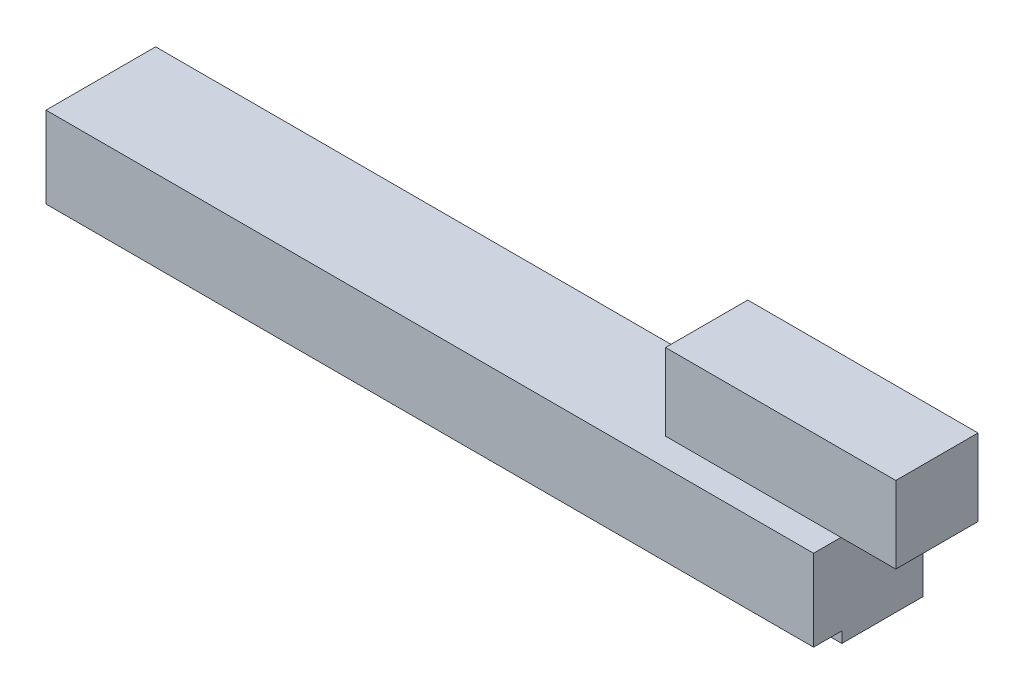
ISO-10303-21;
HEADER;
FILE_DESCRIPTION(('STEP AP214'),'2;1');
FILE_NAME('part.step','',(''),(''),'','','');
FILE_SCHEMA(('AUTOMOTIVE_DESIGN { 1 0 10303 214 1 1 1 1 }'));
ENDSEC;
DATA;
#1=APPLICATION_CONTEXT('core data for automotive mechanical design processes');
#2=APPLICATION_PROTOCOL_DEFINITION('international standard','automotive_design',2000,#1);
#3=PRODUCT_CONTEXT('',#1,'mechanical');
#4=PRODUCT('Part','Part','',(#3));
#5=PRODUCT_RELATED_PRODUCT_CATEGORY('part','',(#4));
#6=PRODUCT_DEFINITION_FORMATION('','',#4);
#7=PRODUCT_DEFINITION_CONTEXT('part definition',#1,'design');
#8=PRODUCT_DEFINITION('design','',#6,#7);
#9=PRODUCT_DEFINITION_SHAPE('','',#8);
#10=(LENGTH_UNIT() NAMED_UNIT(*) SI_UNIT(.MILLI.,.METRE.));
#11=(NAMED_UNIT(*) PLANE_ANGLE_UNIT() SI_UNIT($,.RADIAN.));
#12=(NAMED_UNIT(*) SI_UNIT($,.STERADIAN.) SOLID_ANGLE_UNIT());
#13=UNCERTAINTY_MEASURE_WITH_UNIT(LENGTH_MEASURE(1.E-05),#10,'distance_accuracy_value','');
#14=(GEOMETRIC_REPRESENTATION_CONTEXT(3) GLOBAL_UNCERTAINTY_ASSIGNED_CONTEXT((#13)) GLOBAL_UNIT_ASSIGNED_CONTEXT((#10,
#11,#12)) REPRESENTATION_CONTEXT('',''));
#15=CARTESIAN_POINT('',(0.,0.,0.));
#16=DIRECTION('',(0.,0.,1.));
#17=DIRECTION('',(1.,0.,0.));
#18=AXIS2_PLACEMENT_3D('',#15,#16,#17);
#19=CARTESIAN_POINT('',(140.,-6.41999999998371,0.));
#20=DIRECTION('',(0.,1.,0.));
#21=DIRECTION('',(0.,0.,1.));
#22=AXIS2_PLACEMENT_3D('',#19,#20,#21);
#23=PLANE('',#22);
#24=DIRECTION('',(0.,0.,-1.));
#25=VECTOR('',#24,1.);
#26=CARTESIAN_POINT('',(0.,-6.41999999998371,0.));
#27=LINE('',#26,#25);
#28=CARTESIAN_POINT('',(0.,-6.41999999998371,9.99999999999999));
#29=VERTEX_POINT('',#28);
#30=CARTESIAN_POINT('',(0.,-6.41999999998371,4.83999999998369));
#31=VERTEX_POINT('',#30);
#32=EDGE_CURVE('E137',#29,#31,#27,.T.);
#33=ORIENTED_EDGE('',*,*,#32,.T.);
#34=DIRECTION('',(-1.,0.,0.));
#35=VECTOR('',#34,1.);
#36=CARTESIAN_POINT('',(140.,-6.41999999998371,4.83999999998369));
#37=LINE('',#36,#35);
#38=CARTESIAN_POINT('',(140.,-6.41999999998371,4.83999999998369));
#39=VERTEX_POINT('',#38);
#40=EDGE_CURVE('E11',#39,#31,#37,.T.);
#41=ORIENTED_EDGE('',*,*,#40,.F.);
#42=DIRECTION('',(0.,0.,-1.));
#43=VECTOR('',#42,1.);
#44=CARTESIAN_POINT('',(140.,-6.41999999998371,0.));
#45=LINE('',#44,#43);
#46=CARTESIAN_POINT('',(140.,-6.41999999998371,9.99999999999999));
#47=VERTEX_POINT('',#46);
#48=EDGE_CURVE('E149',#47,#39,#45,.T.);
#49=ORIENTED_EDGE('',*,*,#48,.F.);
#50=DIRECTION('',(-1.,0.,0.));
#51=VECTOR('',#50,1.);
#52=CARTESIAN_POINT('',(140.,-6.41999999998371,9.99999999999999));
#53=LINE('',#52,#51);
#54=EDGE_CURVE('E163',#47,#29,#53,.T.);
#55=ORIENTED_EDGE('',*,*,#54,.T.);
#56=EDGE_LOOP('',(#33,#41,#49,#55));
#57=FACE_BOUND('',#56,.T.);
#58=ADVANCED_FACE('F41',(#57),#23,.F.);
#59=CARTESIAN_POINT('',(140.,0.,4.83999999998369));
#60=DIRECTION('',(0.,0.,-1.));
#61=DIRECTION('',(-1.,0.,0.));
#62=AXIS2_PLACEMENT_3D('',#59,#60,#61);
#63=PLANE('',#62);
#64=DIRECTION('',(0.,-1.,0.));
#65=VECTOR('',#64,1.);
#66=CARTESIAN_POINT('',(0.,0.,4.83999999998369));
#67=LINE('',#66,#65);
#68=CARTESIAN_POINT('',(0.,-8.42,4.83999999998369));
#69=VERTEX_POINT('',#68);
#70=EDGE_CURVE('E141',#31,#69,#67,.T.);
#71=ORIENTED_EDGE('',*,*,#70,.T.);
#72=DIRECTION('',(-1.,0.,0.));
#73=VECTOR('',#72,1.);
#74=CARTESIAN_POINT('',(140.,-8.42,4.83999999998369));
#75=LINE('',#74,#73);
#76=CARTESIAN_POINT('',(140.,-8.42,4.83999999998369));
#77=VERTEX_POINT('',#76);
#78=EDGE_CURVE('E48',#77,#69,#75,.T.);
#79=ORIENTED_EDGE('',*,*,#78,.F.);
#80=DIRECTION('',(0.,-1.,0.));
#81=VECTOR('',#80,1.);
#82=CARTESIAN_POINT('',(140.,0.,4.83999999998369));
#83=LINE('',#82,#81);
#84=EDGE_CURVE('E155',#39,#77,#83,.T.);
#85=ORIENTED_EDGE('',*,*,#84,.F.);
#86=ORIENTED_EDGE('',*,*,#40,.T.);
#87=EDGE_LOOP('',(#71,#79,#85,#86));
#88=FACE_BOUND('',#87,.T.);
#89=ADVANCED_FACE('F232',(#88),#63,.F.);
#90=CARTESIAN_POINT('',(140.,-8.42,0.));
#91=DIRECTION('',(0.,1.,0.));
#92=DIRECTION('',(0.,0.,1.));
#93=AXIS2_PLACEMENT_3D('',#90,#91,#92);
#94=PLANE('',#93);
#95=DIRECTION('',(0.,0.,-1.));
#96=VECTOR('',#95,1.);
#97=CARTESIAN_POINT('',(0.,-8.42,0.));
#98=LINE('',#97,#96);
#99=CARTESIAN_POINT('',(0.,-8.42,-10.));
#100=VERTEX_POINT('',#99);
#101=EDGE_CURVE('E170',#69,#100,#98,.T.);
#102=ORIENTED_EDGE('',*,*,#101,.T.);
#103=DIRECTION('',(-1.,0.,0.));
#104=VECTOR('',#103,1.);
#105=CARTESIAN_POINT('',(140.,-8.42,-10.));
#106=LINE('',#105,#104);
#107=CARTESIAN_POINT('',(140.,-8.42,-10.));
#108=VERTEX_POINT('',#107);
#109=EDGE_CURVE('E185',#108,#100,#106,.T.);
#110=ORIENTED_EDGE('',*,*,#109,.F.);
#111=DIRECTION('',(0.,0.,-1.));
#112=VECTOR('',#111,1.);
#113=CARTESIAN_POINT('',(140.,-8.42,0.));
#114=LINE('',#113,#112);
#115=EDGE_CURVE('E154',#77,#108,#114,.T.);
#116=ORIENTED_EDGE('',*,*,#115,.F.);
#117=ORIENTED_EDGE('',*,*,#78,.T.);
#118=EDGE_LOOP('',(#102,#110,#116,#117));
#119=FACE_BOUND('',#118,.T.);
#120=ADVANCED_FACE('F188',(#119),#94,.F.);
#121=CARTESIAN_POINT('',(140.,0.,-10.));
#122=DIRECTION('',(0.,0.,1.));
#123=DIRECTION('',(1.,0.,0.));
#124=AXIS2_PLACEMENT_3D('',#121,#122,#123);
#125=PLANE('',#124);
#126=DIRECTION('',(0.,1.,0.));
#127=VECTOR('',#126,1.);
#128=CARTESIAN_POINT('',(0.,0.,-10.));
#129=LINE('',#128,#127);
#130=CARTESIAN_POINT('',(0.,8.42,-10.));
#131=VERTEX_POINT('',#130);
#132=EDGE_CURVE('E166',#100,#131,#129,.T.);
#133=ORIENTED_EDGE('',*,*,#132,.T.);
#134=DIRECTION('',(-1.,0.,0.));
#135=VECTOR('',#134,1.);
#136=CARTESIAN_POINT('',(140.,8.42,-10.));
#137=LINE('',#136,#135);
#138=CARTESIAN_POINT('',(108.,8.42,-10.));
#139=VERTEX_POINT('',#138);
#140=EDGE_CURVE('E177',#139,#131,#137,.T.);
#141=ORIENTED_EDGE('',*,*,#140,.F.);
#142=DIRECTION('',(0.,-1.,0.));
#143=VECTOR('',#142,1.);
#144=CARTESIAN_POINT('',(108.,22.42,-10.));
#145=LINE('',#144,#143);
#146=CARTESIAN_POINT('',(108.,22.42,-10.));
#147=VERTEX_POINT('',#146);
#148=EDGE_CURVE('E219',#147,#139,#145,.T.);
#149=ORIENTED_EDGE('',*,*,#148,.F.);
#150=DIRECTION('',(-1.,0.,0.));
#151=VECTOR('',#150,1.);
#152=CARTESIAN_POINT('',(108.,22.42,-10.));
#153=LINE('',#152,#151);
#154=CARTESIAN_POINT('',(150.,22.42,-10.));
#155=VERTEX_POINT('',#154);
#156=EDGE_CURVE('E132',#155,#147,#153,.T.);
#157=ORIENTED_EDGE('',*,*,#156,.F.);
#158=DIRECTION('',(0.,-1.,0.));
#159=VECTOR('',#158,1.);
#160=CARTESIAN_POINT('',(150.,22.42,-10.));
#161=LINE('',#160,#159);
#162=CARTESIAN_POINT('',(150.,8.42,-10.));
#163=VERTEX_POINT('',#162);
#164=EDGE_CURVE('E144',#155,#163,#161,.T.);
#165=ORIENTED_EDGE('',*,*,#164,.T.);
#166=DIRECTION('',(-1.,0.,0.));
#167=VECTOR('',#166,1.);
#168=CARTESIAN_POINT('',(108.,8.42,-10.));
#169=LINE('',#168,#167);
#170=CARTESIAN_POINT('',(140.,8.42,-10.));
#171=VERTEX_POINT('',#170);
#172=EDGE_CURVE('E140',#163,#171,#169,.T.);
#173=ORIENTED_EDGE('',*,*,#172,.T.);
#174=DIRECTION('',(0.,1.,0.));
#175=VECTOR('',#174,1.);
#176=CARTESIAN_POINT('',(140.,0.,-10.));
#177=LINE('',#176,#175);
#178=EDGE_CURVE('E160',#108,#171,#177,.T.);
#179=ORIENTED_EDGE('',*,*,#178,.F.);
#180=ORIENTED_EDGE('',*,*,#109,.T.);
#181=EDGE_LOOP('',(#133,#141,#149,#157,#165,#173,#179,#180));
#182=FACE_BOUND('',#181,.T.);
#183=ADVANCED_FACE('F196',(#182),#125,.F.);
#184=CARTESIAN_POINT('',(140.,8.42,0.));
#185=DIRECTION('',(0.,1.,0.));
#186=DIRECTION('',(0.,0.,1.));
#187=AXIS2_PLACEMENT_3D('',#184,#185,#186);
#188=PLANE('',#187);
#189=DIRECTION('',(0.,0.,1.));
#190=VECTOR('',#189,1.);
#191=CARTESIAN_POINT('',(108.,8.42,-10.));
#192=LINE('',#191,#190);
#193=CARTESIAN_POINT('',(108.,8.42,5.));
#194=VERTEX_POINT('',#193);
#195=EDGE_CURVE('E58',#139,#194,#192,.T.);
#196=ORIENTED_EDGE('',*,*,#195,.F.);
#197=ORIENTED_EDGE('',*,*,#140,.T.);
#198=DIRECTION('',(0.,0.,-1.));
#199=VECTOR('',#198,1.);
#200=CARTESIAN_POINT('',(0.,8.42,0.));
#201=LINE('',#200,#199);
#202=CARTESIAN_POINT('',(0.,8.42,9.99999999999999));
#203=VERTEX_POINT('',#202);
#204=EDGE_CURVE('E175',#203,#131,#201,.T.);
#205=ORIENTED_EDGE('',*,*,#204,.F.);
#206=DIRECTION('',(-1.,0.,0.));
#207=VECTOR('',#206,1.);
#208=CARTESIAN_POINT('',(140.,8.42,9.99999999999999));
#209=LINE('',#208,#207);
#210=CARTESIAN_POINT('',(140.,8.42,9.99999999999999));
#211=VERTEX_POINT('',#210);
#212=EDGE_CURVE('E176',#211,#203,#209,.T.);
#213=ORIENTED_EDGE('',*,*,#212,.F.);
#214=DIRECTION('',(0.,0.,-1.));
#215=VECTOR('',#214,1.);
#216=CARTESIAN_POINT('',(140.,8.42,0.));
#217=LINE('',#216,#215);
#218=CARTESIAN_POINT('',(140.,8.42,5.));
#219=VERTEX_POINT('',#218);
#220=EDGE_CURVE('E159',#211,#219,#217,.T.);
#221=ORIENTED_EDGE('',*,*,#220,.T.);
#222=DIRECTION('',(1.,0.,0.));
#223=VECTOR('',#222,1.);
#224=CARTESIAN_POINT('',(108.,8.42,5.));
#225=LINE('',#224,#223);
#226=EDGE_CURVE('E54',#194,#219,#225,.T.);
#227=ORIENTED_EDGE('',*,*,#226,.F.);
#228=EDGE_LOOP('',(#196,#197,#205,#213,#221,#227));
#229=FACE_BOUND('',#228,.T.);
#230=ADVANCED_FACE('F248',(#229),#188,.T.);
#231=CARTESIAN_POINT('',(140.,0.,9.99999999999999));
#232=DIRECTION('',(0.,0.,1.));
#233=DIRECTION('',(1.,0.,0.));
#234=AXIS2_PLACEMENT_3D('',#231,#232,#233);
#235=PLANE('',#234);
#236=DIRECTION('',(0.,1.,0.));
#237=VECTOR('',#236,1.);
#238=CARTESIAN_POINT('',(0.,0.,9.99999999999999));
#239=LINE('',#238,#237);
#240=EDGE_CURVE('E153',#29,#203,#239,.T.);
#241=ORIENTED_EDGE('',*,*,#240,.F.);
#242=ORIENTED_EDGE('',*,*,#54,.F.);
#243=DIRECTION('',(0.,1.,0.));
#244=VECTOR('',#243,1.);
#245=CARTESIAN_POINT('',(140.,0.,9.99999999999999));
#246=LINE('',#245,#244);
#247=EDGE_CURVE('E165',#47,#211,#246,.T.);
#248=ORIENTED_EDGE('',*,*,#247,.T.);
#249=ORIENTED_EDGE('',*,*,#212,.T.);
#250=EDGE_LOOP('',(#241,#242,#248,#249));
#251=FACE_BOUND('',#250,.T.);
#252=ADVANCED_FACE('F243',(#251),#235,.T.);
#253=CARTESIAN_POINT('',(140.,0.,0.));
#254=DIRECTION('',(1.,0.,0.));
#255=DIRECTION('',(0.,0.,-1.));
#256=AXIS2_PLACEMENT_3D('',#253,#254,#255);
#257=PLANE('',#256);
#258=ORIENTED_EDGE('',*,*,#48,.T.);
#259=ORIENTED_EDGE('',*,*,#84,.T.);
#260=ORIENTED_EDGE('',*,*,#115,.T.);
#261=ORIENTED_EDGE('',*,*,#178,.T.);
#262=EDGE_CURVE('E157',#219,#171,#217,.T.);
#263=ORIENTED_EDGE('',*,*,#262,.F.);
#264=ORIENTED_EDGE('',*,*,#220,.F.);
#265=ORIENTED_EDGE('',*,*,#247,.F.);
#266=EDGE_LOOP('',(#258,#259,#260,#261,#263,#264,#265));
#267=FACE_BOUND('',#266,.T.);
#268=ADVANCED_FACE('F206',(#267),#257,.T.);
#269=CARTESIAN_POINT('',(0.,0.,0.));
#270=DIRECTION('',(1.,0.,0.));
#271=DIRECTION('',(0.,0.,-1.));
#272=AXIS2_PLACEMENT_3D('',#269,#270,#271);
#273=PLANE('',#272);
#274=ORIENTED_EDGE('',*,*,#32,.F.);
#275=ORIENTED_EDGE('',*,*,#240,.T.);
#276=ORIENTED_EDGE('',*,*,#204,.T.);
#277=ORIENTED_EDGE('',*,*,#132,.F.);
#278=ORIENTED_EDGE('',*,*,#101,.F.);
#279=ORIENTED_EDGE('',*,*,#70,.F.);
#280=EDGE_LOOP('',(#274,#275,#276,#277,#278,#279));
#281=FACE_BOUND('',#280,.T.);
#282=ADVANCED_FACE('F192',(#281),#273,.F.);
#283=CARTESIAN_POINT('',(0.,8.42,0.));
#284=DIRECTION('',(0.,1.,0.));
#285=DIRECTION('',(0.,0.,1.));
#286=AXIS2_PLACEMENT_3D('',#283,#284,#285);
#287=PLANE('',#286);
#288=CARTESIAN_POINT('',(150.,8.42,5.));
#289=VERTEX_POINT('',#288);
#290=EDGE_CURVE('E215',#219,#289,#225,.T.);
#291=ORIENTED_EDGE('',*,*,#290,.F.);
#292=ORIENTED_EDGE('',*,*,#262,.T.);
#293=ORIENTED_EDGE('',*,*,#172,.F.);
#294=DIRECTION('',(0.,0.,-1.));
#295=VECTOR('',#294,1.);
#296=CARTESIAN_POINT('',(150.,8.42,-10.));
#297=LINE('',#296,#295);
#298=EDGE_CURVE('E213',#289,#163,#297,.T.);
#299=ORIENTED_EDGE('',*,*,#298,.F.);
#300=EDGE_LOOP('',(#291,#292,#293,#299));
#301=FACE_BOUND('',#300,.T.);
#302=ADVANCED_FACE('F209',(#301),#287,.F.);
#303=CARTESIAN_POINT('',(108.,22.42,-10.));
#304=DIRECTION('',(1.,0.,0.));
#305=DIRECTION('',(0.,0.,-1.));
#306=AXIS2_PLACEMENT_3D('',#303,#304,#305);
#307=PLANE('',#306);
#308=ORIENTED_EDGE('',*,*,#195,.T.);
#309=DIRECTION('',(0.,-1.,0.));
#310=VECTOR('',#309,1.);
#311=CARTESIAN_POINT('',(108.,22.42,5.));
#312=LINE('',#311,#310);
#313=CARTESIAN_POINT('',(108.,22.42,5.));
#314=VERTEX_POINT('',#313);
#315=EDGE_CURVE('E125',#314,#194,#312,.T.);
#316=ORIENTED_EDGE('',*,*,#315,.F.);
#317=DIRECTION('',(0.,0.,1.));
#318=VECTOR('',#317,1.);
#319=CARTESIAN_POINT('',(108.,22.42,-10.));
#320=LINE('',#319,#318);
#321=EDGE_CURVE('E126',#147,#314,#320,.T.);
#322=ORIENTED_EDGE('',*,*,#321,.F.);
#323=ORIENTED_EDGE('',*,*,#148,.T.);
#324=EDGE_LOOP('',(#308,#316,#322,#323));
#325=FACE_BOUND('',#324,.T.);
#326=ADVANCED_FACE('F139',(#325),#307,.F.);
#327=CARTESIAN_POINT('',(108.,22.42,5.));
#328=DIRECTION('',(0.,0.,-1.));
#329=DIRECTION('',(-1.,0.,0.));
#330=AXIS2_PLACEMENT_3D('',#327,#328,#329);
#331=PLANE('',#330);
#332=ORIENTED_EDGE('',*,*,#226,.T.);
#333=ORIENTED_EDGE('',*,*,#290,.T.);
#334=DIRECTION('',(0.,-1.,0.));
#335=VECTOR('',#334,1.);
#336=CARTESIAN_POINT('',(150.,22.42,5.));
#337=LINE('',#336,#335);
#338=CARTESIAN_POINT('',(150.,22.42,5.));
#339=VERTEX_POINT('',#338);
#340=EDGE_CURVE('E124',#339,#289,#337,.T.);
#341=ORIENTED_EDGE('',*,*,#340,.F.);
#342=DIRECTION('',(1.,0.,0.));
#343=VECTOR('',#342,1.);
#344=CARTESIAN_POINT('',(108.,22.42,5.));
#345=LINE('',#344,#343);
#346=EDGE_CURVE('E117',#314,#339,#345,.T.);
#347=ORIENTED_EDGE('',*,*,#346,.F.);
#348=ORIENTED_EDGE('',*,*,#315,.T.);
#349=EDGE_LOOP('',(#332,#333,#341,#347,#348));
#350=FACE_BOUND('',#349,.T.);
#351=ADVANCED_FACE('F119',(#350),#331,.F.);
#352=CARTESIAN_POINT('',(150.,22.42,-10.));
#353=DIRECTION('',(-1.,0.,0.));
#354=DIRECTION('',(0.,0.,1.));
#355=AXIS2_PLACEMENT_3D('',#352,#353,#354);
#356=PLANE('',#355);
#357=ORIENTED_EDGE('',*,*,#298,.T.);
#358=ORIENTED_EDGE('',*,*,#164,.F.);
#359=DIRECTION('',(0.,0.,-1.));
#360=VECTOR('',#359,1.);
#361=CARTESIAN_POINT('',(150.,22.42,-10.));
#362=LINE('',#361,#360);
#363=EDGE_CURVE('E130',#339,#155,#362,.T.);
#364=ORIENTED_EDGE('',*,*,#363,.F.);
#365=ORIENTED_EDGE('',*,*,#340,.T.);
#366=EDGE_LOOP('',(#357,#358,#364,#365));
#367=FACE_BOUND('',#366,.T.);
#368=ADVANCED_FACE('F224',(#367),#356,.F.);
#369=CARTESIAN_POINT('',(0.,22.42,0.));
#370=DIRECTION('',(0.,1.,0.));
#371=DIRECTION('',(0.,0.,1.));
#372=AXIS2_PLACEMENT_3D('',#369,#370,#371);
#373=PLANE('',#372);
#374=ORIENTED_EDGE('',*,*,#321,.T.);
#375=ORIENTED_EDGE('',*,*,#346,.T.);
#376=ORIENTED_EDGE('',*,*,#363,.T.);
#377=ORIENTED_EDGE('',*,*,#156,.T.);
#378=EDGE_LOOP('',(#374,#375,#376,#377));
#379=FACE_BOUND('',#378,.T.);
#380=ADVANCED_FACE('F131',(#379),#373,.T.);
#381=CLOSED_SHELL('',(#58,#89,#120,#183,#230,#252,#268,#282,#302,#326,#351,#368,#380));
#382=MANIFOLD_SOLID_BREP('B2',#381);
#383=ADVANCED_BREP_SHAPE_REPRESENTATION('',(#18,#382),#14);
#384=SHAPE_DEFINITION_REPRESENTATION(#9,#383);
ENDSEC;
END-ISO-10303-21;
